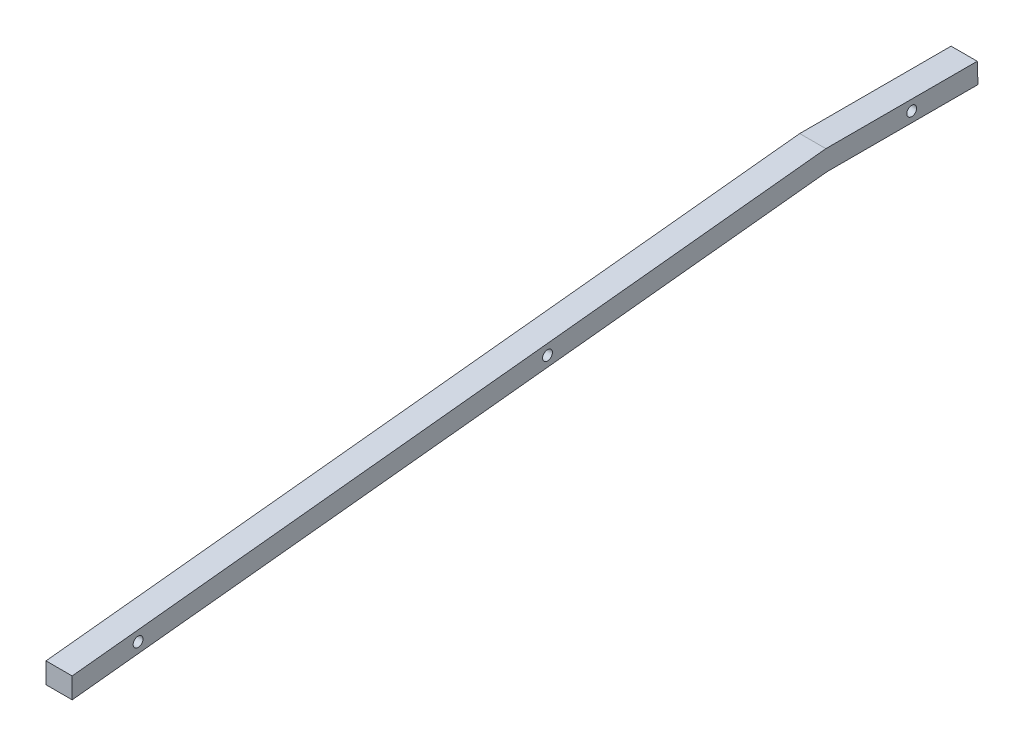
ISO-10303-21;
HEADER;
FILE_DESCRIPTION(('STEP AP214'),'2;1');
FILE_NAME('part.step','',(''),(''),'','','');
FILE_SCHEMA(('AUTOMOTIVE_DESIGN { 1 0 10303 214 1 1 1 1 }'));
ENDSEC;
DATA;
#1=APPLICATION_CONTEXT('core data for automotive mechanical design processes');
#2=APPLICATION_PROTOCOL_DEFINITION('international standard','automotive_design',2000,#1);
#3=PRODUCT_CONTEXT('',#1,'mechanical');
#4=PRODUCT('Part','Part','',(#3));
#5=PRODUCT_RELATED_PRODUCT_CATEGORY('part','',(#4));
#6=PRODUCT_DEFINITION_FORMATION('','',#4);
#7=PRODUCT_DEFINITION_CONTEXT('part definition',#1,'design');
#8=PRODUCT_DEFINITION('design','',#6,#7);
#9=PRODUCT_DEFINITION_SHAPE('','',#8);
#10=(LENGTH_UNIT() NAMED_UNIT(*) SI_UNIT(.MILLI.,.METRE.));
#11=(NAMED_UNIT(*) PLANE_ANGLE_UNIT() SI_UNIT($,.RADIAN.));
#12=(NAMED_UNIT(*) SI_UNIT($,.STERADIAN.) SOLID_ANGLE_UNIT());
#13=UNCERTAINTY_MEASURE_WITH_UNIT(LENGTH_MEASURE(1.E-05),#10,'distance_accuracy_value','');
#14=(GEOMETRIC_REPRESENTATION_CONTEXT(3) GLOBAL_UNCERTAINTY_ASSIGNED_CONTEXT((#13)) GLOBAL_UNIT_ASSIGNED_CONTEXT((#10,
#11,#12)) REPRESENTATION_CONTEXT('',''));
#15=CARTESIAN_POINT('',(0.,0.,0.));
#16=DIRECTION('',(0.,0.,1.));
#17=DIRECTION('',(1.,0.,0.));
#18=AXIS2_PLACEMENT_3D('',#15,#16,#17);
#19=CARTESIAN_POINT('',(6.35,-6.15926603688948,84.4844142231074));
#20=DIRECTION('',(0.,-0.994441412130737,-0.105291394897329));
#21=DIRECTION('',(0.,0.105291394897329,-0.994441412130737));
#22=AXIS2_PLACEMENT_3D('',#19,#20,#21);
#23=PLANE('',#22);
#24=DIRECTION('',(0.,-0.105291394897329,0.994441412130737));
#25=VECTOR('',#24,1.);
#26=CARTESIAN_POINT('',(0.,-6.15926603688948,84.4844142231074));
#27=LINE('',#26,#25);
#28=CARTESIAN_POINT('',(0.,13.2098737335112,-98.4505228989323));
#29=VERTEX_POINT('',#28);
#30=CARTESIAN_POINT('',(0.,-6.15926603688948,84.4844142231074));
#31=VERTEX_POINT('',#30);
#32=EDGE_CURVE('E117',#29,#31,#27,.T.);
#33=ORIENTED_EDGE('',*,*,#32,.T.);
#34=DIRECTION('',(-1.,0.,0.));
#35=VECTOR('',#34,1.);
#36=CARTESIAN_POINT('',(6.35,-6.15926603688948,84.4844142231074));
#37=LINE('',#36,#35);
#38=CARTESIAN_POINT('',(6.35,-6.15926603688948,84.4844142231074));
#39=VERTEX_POINT('',#38);
#40=EDGE_CURVE('E11',#39,#31,#37,.T.);
#41=ORIENTED_EDGE('',*,*,#40,.F.);
#42=DIRECTION('',(0.,-0.105291394897329,0.994441412130737));
#43=VECTOR('',#42,1.);
#44=CARTESIAN_POINT('',(6.35,-6.15926603688948,84.4844142231074));
#45=LINE('',#44,#43);
#46=CARTESIAN_POINT('',(6.35,13.2098737335112,-98.4505228989323));
#47=VERTEX_POINT('',#46);
#48=EDGE_CURVE('E128',#47,#39,#45,.T.);
#49=ORIENTED_EDGE('',*,*,#48,.F.);
#50=DIRECTION('',(-1.,0.,0.));
#51=VECTOR('',#50,1.);
#52=CARTESIAN_POINT('',(6.35,13.2098737335112,-98.4505228989323));
#53=LINE('',#52,#51);
#54=EDGE_CURVE('E113',#47,#29,#53,.T.);
#55=ORIENTED_EDGE('',*,*,#54,.T.);
#56=EDGE_LOOP('',(#33,#41,#49,#55));
#57=FACE_BOUND('',#56,.T.);
#58=ADVANCED_FACE('F33',(#57),#23,.F.);
#59=CARTESIAN_POINT('',(6.35,-6.15926603688948,84.4844142231074));
#60=DIRECTION('',(0.,0.,-1.));
#61=DIRECTION('',(-1.,0.,0.));
#62=AXIS2_PLACEMENT_3D('',#59,#60,#61);
#63=PLANE('',#62);
#64=DIRECTION('',(0.,-1.,0.));
#65=VECTOR('',#64,1.);
#66=CARTESIAN_POINT('',(0.,-6.15926603688948,84.4844142231074));
#67=LINE('',#66,#65);
#68=CARTESIAN_POINT('',(0.,-11.1872143292748,84.4844142231074));
#69=VERTEX_POINT('',#68);
#70=EDGE_CURVE('E120',#31,#69,#67,.T.);
#71=ORIENTED_EDGE('',*,*,#70,.T.);
#72=DIRECTION('',(-1.,0.,0.));
#73=VECTOR('',#72,1.);
#74=CARTESIAN_POINT('',(6.35,-11.1872143292748,84.4844142231074));
#75=LINE('',#74,#73);
#76=CARTESIAN_POINT('',(6.35,-11.1872143292748,84.4844142231074));
#77=VERTEX_POINT('',#76);
#78=EDGE_CURVE('E41',#77,#69,#75,.T.);
#79=ORIENTED_EDGE('',*,*,#78,.F.);
#80=DIRECTION('',(0.,-1.,0.));
#81=VECTOR('',#80,1.);
#82=CARTESIAN_POINT('',(6.35,-6.15926603688948,84.4844142231074));
#83=LINE('',#82,#81);
#84=EDGE_CURVE('E86',#39,#77,#83,.T.);
#85=ORIENTED_EDGE('',*,*,#84,.F.);
#86=ORIENTED_EDGE('',*,*,#40,.T.);
#87=EDGE_LOOP('',(#71,#79,#85,#86));
#88=FACE_BOUND('',#87,.T.);
#89=ADVANCED_FACE('F153',(#88),#63,.F.);
#90=CARTESIAN_POINT('',(6.35,-11.1872143292748,84.4844142231074));
#91=DIRECTION('',(0.,0.994441412130737,0.105291394897329));
#92=DIRECTION('',(0.,-0.105291394897329,0.994441412130737));
#93=AXIS2_PLACEMENT_3D('',#90,#91,#92);
#94=PLANE('',#93);
#95=DIRECTION('',(0.,0.105291394897329,-0.994441412130737));
#96=VECTOR('',#95,1.);
#97=CARTESIAN_POINT('',(0.,-11.1872143292748,84.4844142231074));
#98=LINE('',#97,#96);
#99=CARTESIAN_POINT('',(0.,8.21753390891232,-98.7868327656974));
#100=VERTEX_POINT('',#99);
#101=EDGE_CURVE('E123',#69,#100,#98,.T.);
#102=ORIENTED_EDGE('',*,*,#101,.T.);
#103=DIRECTION('',(-1.,0.,0.));
#104=VECTOR('',#103,1.);
#105=CARTESIAN_POINT('',(6.35,8.21753390891232,-98.7868327656974));
#106=LINE('',#105,#104);
#107=CARTESIAN_POINT('',(6.35,8.21753390891232,-98.7868327656974));
#108=VERTEX_POINT('',#107);
#109=EDGE_CURVE('E108',#108,#100,#106,.T.);
#110=ORIENTED_EDGE('',*,*,#109,.F.);
#111=DIRECTION('',(0.,0.105291394897329,-0.994441412130737));
#112=VECTOR('',#111,1.);
#113=CARTESIAN_POINT('',(6.35,-11.1872143292748,84.4844142231074));
#114=LINE('',#113,#112);
#115=EDGE_CURVE('E99',#77,#108,#114,.T.);
#116=ORIENTED_EDGE('',*,*,#115,.F.);
#117=ORIENTED_EDGE('',*,*,#78,.T.);
#118=EDGE_LOOP('',(#102,#110,#116,#117));
#119=FACE_BOUND('',#118,.T.);
#120=ADVANCED_FACE('F134',(#119),#94,.F.);
#121=CARTESIAN_POINT('',(6.35,8.21753390891232,-98.7868327656974));
#122=DIRECTION('',(0.,0.999999983650718,-0.000180827443469066));
#123=DIRECTION('',(0.,0.000180827443469066,0.999999983650718));
#124=AXIS2_PLACEMENT_3D('',#121,#122,#123);
#125=PLANE('',#124);
#126=DIRECTION('',(0.,-0.000180827443469066,-0.999999983650718));
#127=VECTOR('',#126,1.);
#128=CARTESIAN_POINT('',(0.,8.21753390891232,-98.7868327656974));
#129=LINE('',#128,#127);
#130=CARTESIAN_POINT('',(0.,8.2109171202989,-135.378560095906));
#131=VERTEX_POINT('',#130);
#132=EDGE_CURVE('E107',#100,#131,#129,.T.);
#133=ORIENTED_EDGE('',*,*,#132,.T.);
#134=DIRECTION('',(-1.,0.,0.));
#135=VECTOR('',#134,1.);
#136=CARTESIAN_POINT('',(6.35,8.2109171202989,-135.378560095906));
#137=LINE('',#136,#135);
#138=CARTESIAN_POINT('',(6.35,8.2109171202989,-135.378560095906));
#139=VERTEX_POINT('',#138);
#140=EDGE_CURVE('E104',#139,#131,#137,.T.);
#141=ORIENTED_EDGE('',*,*,#140,.F.);
#142=DIRECTION('',(0.,-0.000180827443469066,-0.999999983650718));
#143=VECTOR('',#142,1.);
#144=CARTESIAN_POINT('',(6.35,8.21753390891232,-98.7868327656974));
#145=LINE('',#144,#143);
#146=EDGE_CURVE('E93',#108,#139,#145,.T.);
#147=ORIENTED_EDGE('',*,*,#146,.F.);
#148=ORIENTED_EDGE('',*,*,#109,.T.);
#149=EDGE_LOOP('',(#133,#141,#147,#148));
#150=FACE_BOUND('',#149,.T.);
#151=ADVANCED_FACE('F105',(#150),#125,.F.);
#152=CARTESIAN_POINT('',(6.35,13.2109171202989,-135.196228698076));
#153=DIRECTION('',(0.,-0.0364420574825274,0.999335767620893));
#154=DIRECTION('',(0.,-0.999335767620893,-0.0364420574825274));
#155=AXIS2_PLACEMENT_3D('',#152,#153,#154);
#156=PLANE('',#155);
#157=DIRECTION('',(0.,0.999335767620893,0.0364420574825274));
#158=VECTOR('',#157,1.);
#159=CARTESIAN_POINT('',(0.,13.2109171202989,-135.196228698076));
#160=LINE('',#159,#158);
#161=CARTESIAN_POINT('',(0.,13.2109171202989,-135.196228698076));
#162=VERTEX_POINT('',#161);
#163=EDGE_CURVE('E72',#131,#162,#160,.T.);
#164=ORIENTED_EDGE('',*,*,#163,.T.);
#165=DIRECTION('',(-1.,0.,0.));
#166=VECTOR('',#165,1.);
#167=CARTESIAN_POINT('',(6.35,13.2109171202989,-135.196228698076));
#168=LINE('',#167,#166);
#169=CARTESIAN_POINT('',(6.35,13.2109171202989,-135.196228698076));
#170=VERTEX_POINT('',#169);
#171=EDGE_CURVE('E109',#170,#162,#168,.T.);
#172=ORIENTED_EDGE('',*,*,#171,.F.);
#173=DIRECTION('',(0.,0.999335767620893,0.0364420574825274));
#174=VECTOR('',#173,1.);
#175=CARTESIAN_POINT('',(6.35,13.2109171202989,-135.196228698076));
#176=LINE('',#175,#174);
#177=EDGE_CURVE('E97',#139,#170,#176,.T.);
#178=ORIENTED_EDGE('',*,*,#177,.F.);
#179=ORIENTED_EDGE('',*,*,#140,.T.);
#180=EDGE_LOOP('',(#164,#172,#178,#179));
#181=FACE_BOUND('',#180,.T.);
#182=ADVANCED_FACE('F111',(#181),#156,.F.);
#183=CARTESIAN_POINT('',(6.35,13.2098737335112,-98.4505228989323));
#184=DIRECTION('',(0.,-0.999999999596868,-2.83947951097936E-05));
#185=DIRECTION('',(0.,2.83947951097936E-05,-0.999999999596868));
#186=AXIS2_PLACEMENT_3D('',#183,#184,#185);
#187=PLANE('',#186);
#188=DIRECTION('',(0.,-2.83947951097936E-05,0.999999999596868));
#189=VECTOR('',#188,1.);
#190=CARTESIAN_POINT('',(0.,13.2098737335112,-98.4505228989323));
#191=LINE('',#190,#189);
#192=EDGE_CURVE('E78',#162,#29,#191,.T.);
#193=ORIENTED_EDGE('',*,*,#192,.T.);
#194=ORIENTED_EDGE('',*,*,#54,.F.);
#195=DIRECTION('',(0.,-2.83947951097936E-05,0.999999999596868));
#196=VECTOR('',#195,1.);
#197=CARTESIAN_POINT('',(6.35,13.2098737335112,-98.4505228989323));
#198=LINE('',#197,#196);
#199=EDGE_CURVE('E49',#170,#47,#198,.T.);
#200=ORIENTED_EDGE('',*,*,#199,.F.);
#201=ORIENTED_EDGE('',*,*,#171,.T.);
#202=EDGE_LOOP('',(#193,#194,#200,#201));
#203=FACE_BOUND('',#202,.T.);
#204=ADVANCED_FACE('F141',(#203),#187,.F.);
#205=CARTESIAN_POINT('',(6.35,0.,0.));
#206=DIRECTION('',(-1.,0.,0.));
#207=DIRECTION('',(0.,0.,1.));
#208=AXIS2_PLACEMENT_3D('',#205,#206,#207);
#209=PLANE('',#208);
#210=CARTESIAN_POINT('',(6.35,-6.97916117771607,68.4844142231074));
#211=DIRECTION('',(1.,0.,0.));
#212=DIRECTION('',(0.,0.,-1.));
#213=AXIS2_PLACEMENT_3D('',#210,#211,#212);
#214=CIRCLE('',#213,1.19062499999999);
#215=CARTESIAN_POINT('',(6.35,-6.97916117771607,67.2937892231074));
#216=VERTEX_POINT('',#215);
#217=EDGE_CURVE('E229',#216,#216,#214,.T.);
#218=ORIENTED_EDGE('',*,*,#217,.F.);
#219=EDGE_LOOP('',(#218));
#220=FACE_BOUND('',#219,.T.);
#221=CARTESIAN_POINT('',(6.35,3.54254560616764,-30.8895276113004));
#222=DIRECTION('',(1.,0.,0.));
#223=DIRECTION('',(0.,0.,-1.));
#224=AXIS2_PLACEMENT_3D('',#221,#222,#223);
#225=CIRCLE('',#224,1.19062499999999);
#226=CARTESIAN_POINT('',(6.35,3.54254560616764,-32.0801526113004));
#227=VERTEX_POINT('',#226);
#228=EDGE_CURVE('E231',#227,#227,#225,.T.);
#229=ORIENTED_EDGE('',*,*,#228,.F.);
#230=EDGE_LOOP('',(#229));
#231=FACE_BOUND('',#230,.T.);
#232=CARTESIAN_POINT('',(6.35,10.7104650896961,-119.276776098833));
#233=DIRECTION('',(1.,0.,0.));
#234=DIRECTION('',(0.,0.,-1.));
#235=AXIS2_PLACEMENT_3D('',#232,#233,#234);
#236=CIRCLE('',#235,1.19062499999999);
#237=CARTESIAN_POINT('',(6.35,10.7104650896961,-120.467401098833));
#238=VERTEX_POINT('',#237);
#239=EDGE_CURVE('E239',#238,#238,#236,.T.);
#240=ORIENTED_EDGE('',*,*,#239,.F.);
#241=EDGE_LOOP('',(#240));
#242=FACE_BOUND('',#241,.T.);
#243=ORIENTED_EDGE('',*,*,#48,.T.);
#244=ORIENTED_EDGE('',*,*,#84,.T.);
#245=ORIENTED_EDGE('',*,*,#115,.T.);
#246=ORIENTED_EDGE('',*,*,#146,.T.);
#247=ORIENTED_EDGE('',*,*,#177,.T.);
#248=ORIENTED_EDGE('',*,*,#199,.T.);
#249=EDGE_LOOP('',(#243,#244,#245,#246,#247,#248));
#250=FACE_BOUND('',#249,.T.);
#251=ADVANCED_FACE('F95',(#220,#231,#242,#250),#209,.F.);
#252=CARTESIAN_POINT('',(0.,0.,0.));
#253=DIRECTION('',(-1.,0.,0.));
#254=DIRECTION('',(0.,0.,1.));
#255=AXIS2_PLACEMENT_3D('',#252,#253,#254);
#256=PLANE('',#255);
#257=CARTESIAN_POINT('',(0.,-6.97916117771607,68.4844142231074));
#258=DIRECTION('',(-1.,0.,0.));
#259=DIRECTION('',(0.,0.,1.));
#260=AXIS2_PLACEMENT_3D('',#257,#258,#259);
#261=CIRCLE('',#260,1.19062499999999);
#262=CARTESIAN_POINT('',(0.,-6.97916117771607,69.6750392231074));
#263=VERTEX_POINT('',#262);
#264=EDGE_CURVE('E226',#263,#263,#261,.T.);
#265=ORIENTED_EDGE('',*,*,#264,.F.);
#266=EDGE_LOOP('',(#265));
#267=FACE_BOUND('',#266,.T.);
#268=CARTESIAN_POINT('',(0.,3.54254560616764,-30.8895276113004));
#269=DIRECTION('',(-1.,0.,0.));
#270=DIRECTION('',(0.,0.,1.));
#271=AXIS2_PLACEMENT_3D('',#268,#269,#270);
#272=CIRCLE('',#271,1.19062499999999);
#273=CARTESIAN_POINT('',(0.,3.54254560616764,-29.6989026113004));
#274=VERTEX_POINT('',#273);
#275=EDGE_CURVE('E236',#274,#274,#272,.T.);
#276=ORIENTED_EDGE('',*,*,#275,.F.);
#277=EDGE_LOOP('',(#276));
#278=FACE_BOUND('',#277,.T.);
#279=CARTESIAN_POINT('',(0.,10.7104650896961,-119.276776098833));
#280=DIRECTION('',(-1.,0.,0.));
#281=DIRECTION('',(0.,0.,1.));
#282=AXIS2_PLACEMENT_3D('',#279,#280,#281);
#283=CIRCLE('',#282,1.19062499999999);
#284=CARTESIAN_POINT('',(0.,10.7104650896961,-118.086151098833));
#285=VERTEX_POINT('',#284);
#286=EDGE_CURVE('E121',#285,#285,#283,.T.);
#287=ORIENTED_EDGE('',*,*,#286,.F.);
#288=EDGE_LOOP('',(#287));
#289=FACE_BOUND('',#288,.T.);
#290=ORIENTED_EDGE('',*,*,#32,.F.);
#291=ORIENTED_EDGE('',*,*,#192,.F.);
#292=ORIENTED_EDGE('',*,*,#163,.F.);
#293=ORIENTED_EDGE('',*,*,#132,.F.);
#294=ORIENTED_EDGE('',*,*,#101,.F.);
#295=ORIENTED_EDGE('',*,*,#70,.F.);
#296=EDGE_LOOP('',(#290,#291,#292,#293,#294,#295));
#297=FACE_BOUND('',#296,.T.);
#298=ADVANCED_FACE('F137',(#267,#278,#289,#297),#256,.T.);
#299=CARTESIAN_POINT('',(6.35,10.7104650896961,-119.276776098833));
#300=DIRECTION('',(1.,0.,0.));
#301=DIRECTION('',(0.,0.,-1.));
#302=AXIS2_PLACEMENT_3D('',#299,#300,#301);
#303=CYLINDRICAL_SURFACE('',#302,1.19062499999999);
#304=ORIENTED_EDGE('',*,*,#286,.T.);
#305=EDGE_LOOP('',(#304));
#306=FACE_BOUND('',#305,.T.);
#307=ORIENTED_EDGE('',*,*,#239,.T.);
#308=EDGE_LOOP('',(#307));
#309=FACE_BOUND('',#308,.T.);
#310=ADVANCED_FACE('F190',(#306,#309),#303,.F.);
#311=CARTESIAN_POINT('',(6.35,3.54254560616764,-30.8895276113004));
#312=DIRECTION('',(1.,0.,0.));
#313=DIRECTION('',(0.,0.,-1.));
#314=AXIS2_PLACEMENT_3D('',#311,#312,#313);
#315=CYLINDRICAL_SURFACE('',#314,1.19062499999999);
#316=ORIENTED_EDGE('',*,*,#275,.T.);
#317=EDGE_LOOP('',(#316));
#318=FACE_BOUND('',#317,.T.);
#319=ORIENTED_EDGE('',*,*,#228,.T.);
#320=EDGE_LOOP('',(#319));
#321=FACE_BOUND('',#320,.T.);
#322=ADVANCED_FACE('F199',(#318,#321),#315,.F.);
#323=CARTESIAN_POINT('',(6.35,-6.97916117771607,68.4844142231074));
#324=DIRECTION('',(1.,0.,0.));
#325=DIRECTION('',(0.,0.,-1.));
#326=AXIS2_PLACEMENT_3D('',#323,#324,#325);
#327=CYLINDRICAL_SURFACE('',#326,1.19062499999999);
#328=ORIENTED_EDGE('',*,*,#264,.T.);
#329=EDGE_LOOP('',(#328));
#330=FACE_BOUND('',#329,.T.);
#331=ORIENTED_EDGE('',*,*,#217,.T.);
#332=EDGE_LOOP('',(#331));
#333=FACE_BOUND('',#332,.T.);
#334=ADVANCED_FACE('F209',(#330,#333),#327,.F.);
#335=CLOSED_SHELL('',(#58,#89,#120,#151,#182,#204,#251,#298,#310,#322,#334));
#336=MANIFOLD_SOLID_BREP('B2',#335);
#337=ADVANCED_BREP_SHAPE_REPRESENTATION('',(#18,#336),#14);
#338=SHAPE_DEFINITION_REPRESENTATION(#9,#337);
ENDSEC;
END-ISO-10303-21;
